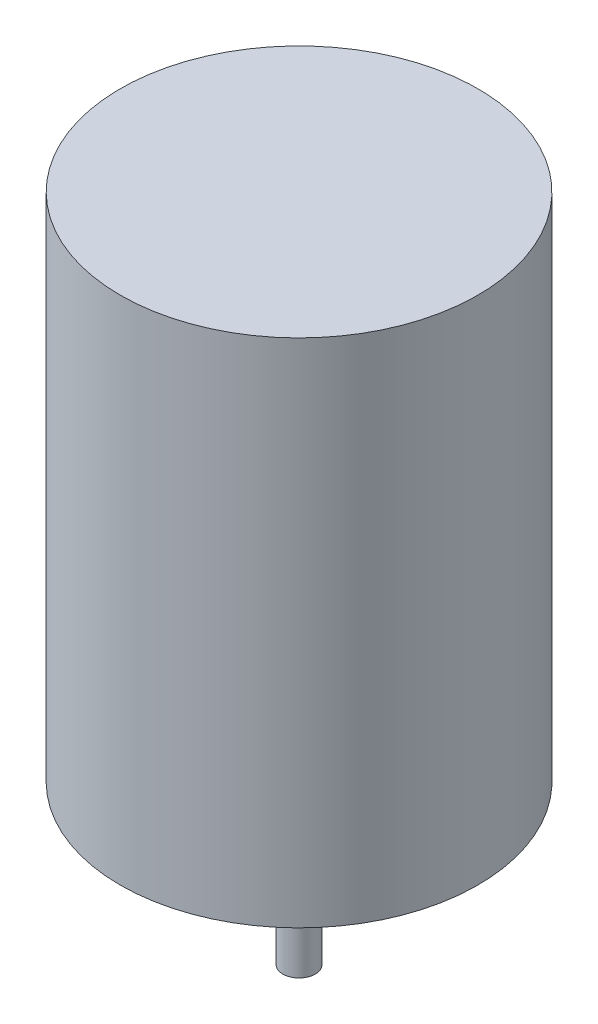
ISO-10303-21;
HEADER;
FILE_DESCRIPTION(('STEP AP214'),'2;1');
FILE_NAME('part.step','',(''),(''),'','','');
FILE_SCHEMA(('AUTOMOTIVE_DESIGN { 1 0 10303 214 1 1 1 1 }'));
ENDSEC;
DATA;
#1=APPLICATION_CONTEXT('core data for automotive mechanical design processes');
#2=APPLICATION_PROTOCOL_DEFINITION('international standard','automotive_design',2000,#1);
#3=PRODUCT_CONTEXT('',#1,'mechanical');
#4=PRODUCT('Part','Part','',(#3));
#5=PRODUCT_RELATED_PRODUCT_CATEGORY('part','',(#4));
#6=PRODUCT_DEFINITION_FORMATION('','',#4);
#7=PRODUCT_DEFINITION_CONTEXT('part definition',#1,'design');
#8=PRODUCT_DEFINITION('design','',#6,#7);
#9=PRODUCT_DEFINITION_SHAPE('','',#8);
#10=(LENGTH_UNIT() NAMED_UNIT(*) SI_UNIT(.MILLI.,.METRE.));
#11=(NAMED_UNIT(*) PLANE_ANGLE_UNIT() SI_UNIT($,.RADIAN.));
#12=(NAMED_UNIT(*) SI_UNIT($,.STERADIAN.) SOLID_ANGLE_UNIT());
#13=UNCERTAINTY_MEASURE_WITH_UNIT(LENGTH_MEASURE(1.E-05),#10,'distance_accuracy_value','');
#14=(GEOMETRIC_REPRESENTATION_CONTEXT(3) GLOBAL_UNCERTAINTY_ASSIGNED_CONTEXT((#13)) GLOBAL_UNIT_ASSIGNED_CONTEXT((#10,
#11,#12)) REPRESENTATION_CONTEXT('',''));
#15=CARTESIAN_POINT('',(0.,0.,0.));
#16=DIRECTION('',(0.,0.,1.));
#17=DIRECTION('',(1.,0.,0.));
#18=AXIS2_PLACEMENT_3D('',#15,#16,#17);
#19=CARTESIAN_POINT('',(0.,50.,0.));
#20=DIRECTION('',(0.,-1.,0.));
#21=DIRECTION('',(0.,0.,-1.));
#22=AXIS2_PLACEMENT_3D('',#19,#20,#21);
#23=CYLINDRICAL_SURFACE('',#22,17.5);
#24=CARTESIAN_POINT('',(0.,50.,0.));
#25=DIRECTION('',(0.,1.,0.));
#26=DIRECTION('',(0.,0.,1.));
#27=AXIS2_PLACEMENT_3D('',#24,#25,#26);
#28=CIRCLE('',#27,17.5);
#29=CARTESIAN_POINT('',(0.,50.,17.5));
#30=VERTEX_POINT('',#29);
#31=EDGE_CURVE('E10',#30,#30,#28,.T.);
#32=ORIENTED_EDGE('',*,*,#31,.F.);
#33=EDGE_LOOP('',(#32));
#34=FACE_BOUND('',#33,.T.);
#35=CARTESIAN_POINT('',(0.,0.,0.));
#36=DIRECTION('',(0.,1.,0.));
#37=DIRECTION('',(0.,0.,1.));
#38=AXIS2_PLACEMENT_3D('',#35,#36,#37);
#39=CIRCLE('',#38,17.5);
#40=CARTESIAN_POINT('',(0.,0.,17.5));
#41=VERTEX_POINT('',#40);
#42=EDGE_CURVE('E33',#41,#41,#39,.T.);
#43=ORIENTED_EDGE('',*,*,#42,.T.);
#44=EDGE_LOOP('',(#43));
#45=FACE_BOUND('',#44,.T.);
#46=ADVANCED_FACE('F30',(#34,#45),#23,.T.);
#47=CARTESIAN_POINT('',(0.,50.,0.));
#48=DIRECTION('',(0.,1.,0.));
#49=DIRECTION('',(0.,0.,1.));
#50=AXIS2_PLACEMENT_3D('',#47,#48,#49);
#51=PLANE('',#50);
#52=ORIENTED_EDGE('',*,*,#31,.T.);
#53=EDGE_LOOP('',(#52));
#54=FACE_BOUND('',#53,.T.);
#55=ADVANCED_FACE('F85',(#54),#51,.T.);
#56=CARTESIAN_POINT('',(0.,0.,0.));
#57=DIRECTION('',(0.,1.,0.));
#58=DIRECTION('',(0.,0.,1.));
#59=AXIS2_PLACEMENT_3D('',#56,#57,#58);
#60=PLANE('',#59);
#61=CARTESIAN_POINT('',(0.,0.,-12.5));
#62=DIRECTION('',(0.,1.,0.));
#63=DIRECTION('',(0.,0.,1.));
#64=AXIS2_PLACEMENT_3D('',#61,#62,#63);
#65=CIRCLE('',#64,1.5);
#66=CARTESIAN_POINT('',(0.,0.,-11.));
#67=VERTEX_POINT('',#66);
#68=EDGE_CURVE('E57',#67,#67,#65,.T.);
#69=ORIENTED_EDGE('',*,*,#68,.T.);
#70=EDGE_LOOP('',(#69));
#71=FACE_BOUND('',#70,.T.);
#72=CARTESIAN_POINT('',(0.,0.,12.5));
#73=DIRECTION('',(0.,1.,0.));
#74=DIRECTION('',(0.,0.,1.));
#75=AXIS2_PLACEMENT_3D('',#72,#73,#74);
#76=CIRCLE('',#75,1.5);
#77=CARTESIAN_POINT('',(0.,0.,14.));
#78=VERTEX_POINT('',#77);
#79=EDGE_CURVE('E54',#78,#78,#76,.T.);
#80=ORIENTED_EDGE('',*,*,#79,.T.);
#81=EDGE_LOOP('',(#80));
#82=FACE_BOUND('',#81,.T.);
#83=CARTESIAN_POINT('',(0.,0.,0.));
#84=DIRECTION('',(0.,1.,0.));
#85=DIRECTION('',(0.,0.,1.));
#86=AXIS2_PLACEMENT_3D('',#83,#84,#85);
#87=CIRCLE('',#86,5.);
#88=CARTESIAN_POINT('',(0.,0.,5.));
#89=VERTEX_POINT('',#88);
#90=EDGE_CURVE('E42',#89,#89,#87,.T.);
#91=ORIENTED_EDGE('',*,*,#90,.T.);
#92=EDGE_LOOP('',(#91));
#93=FACE_BOUND('',#92,.T.);
#94=ORIENTED_EDGE('',*,*,#42,.F.);
#95=EDGE_LOOP('',(#94));
#96=FACE_BOUND('',#95,.T.);
#97=ADVANCED_FACE('F66',(#71,#82,#93,#96),#60,.F.);
#98=CARTESIAN_POINT('',(0.,-2.,0.));
#99=DIRECTION('',(0.,1.,0.));
#100=DIRECTION('',(0.,0.,1.));
#101=AXIS2_PLACEMENT_3D('',#98,#99,#100);
#102=CYLINDRICAL_SURFACE('',#101,5.);
#103=CARTESIAN_POINT('',(0.,-2.,0.));
#104=DIRECTION('',(0.,1.,0.));
#105=DIRECTION('',(0.,0.,1.));
#106=AXIS2_PLACEMENT_3D('',#103,#104,#105);
#107=CIRCLE('',#106,5.);
#108=CARTESIAN_POINT('',(0.,-2.,5.));
#109=VERTEX_POINT('',#108);
#110=EDGE_CURVE('E40',#109,#109,#107,.T.);
#111=ORIENTED_EDGE('',*,*,#110,.T.);
#112=EDGE_LOOP('',(#111));
#113=FACE_BOUND('',#112,.T.);
#114=ORIENTED_EDGE('',*,*,#90,.F.);
#115=EDGE_LOOP('',(#114));
#116=FACE_BOUND('',#115,.T.);
#117=ADVANCED_FACE('F95',(#113,#116),#102,.T.);
#118=CARTESIAN_POINT('',(0.,-2.,0.));
#119=DIRECTION('',(0.,1.,0.));
#120=DIRECTION('',(0.,0.,1.));
#121=AXIS2_PLACEMENT_3D('',#118,#119,#120);
#122=PLANE('',#121);
#123=CARTESIAN_POINT('',(0.,-2.,0.));
#124=DIRECTION('',(0.,1.,0.));
#125=DIRECTION('',(0.,0.,1.));
#126=AXIS2_PLACEMENT_3D('',#123,#124,#125);
#127=CIRCLE('',#126,1.5875);
#128=CARTESIAN_POINT('',(0.,-2.,1.5875));
#129=VERTEX_POINT('',#128);
#130=EDGE_CURVE('E48',#129,#129,#127,.T.);
#131=ORIENTED_EDGE('',*,*,#130,.T.);
#132=EDGE_LOOP('',(#131));
#133=FACE_BOUND('',#132,.T.);
#134=ORIENTED_EDGE('',*,*,#110,.F.);
#135=EDGE_LOOP('',(#134));
#136=FACE_BOUND('',#135,.T.);
#137=ADVANCED_FACE('F99',(#133,#136),#122,.F.);
#138=CARTESIAN_POINT('',(0.,-15.5,0.));
#139=DIRECTION('',(0.,1.,0.));
#140=DIRECTION('',(0.,0.,1.));
#141=AXIS2_PLACEMENT_3D('',#138,#139,#140);
#142=CYLINDRICAL_SURFACE('',#141,1.5875);
#143=CARTESIAN_POINT('',(0.,-15.5,0.));
#144=DIRECTION('',(0.,1.,0.));
#145=DIRECTION('',(0.,0.,1.));
#146=AXIS2_PLACEMENT_3D('',#143,#144,#145);
#147=CIRCLE('',#146,1.5875);
#148=CARTESIAN_POINT('',(0.,-15.5,1.5875));
#149=VERTEX_POINT('',#148);
#150=EDGE_CURVE('E45',#149,#149,#147,.T.);
#151=ORIENTED_EDGE('',*,*,#150,.T.);
#152=EDGE_LOOP('',(#151));
#153=FACE_BOUND('',#152,.T.);
#154=ORIENTED_EDGE('',*,*,#130,.F.);
#155=EDGE_LOOP('',(#154));
#156=FACE_BOUND('',#155,.T.);
#157=ADVANCED_FACE('F105',(#153,#156),#142,.T.);
#158=CARTESIAN_POINT('',(0.,-15.5,0.));
#159=DIRECTION('',(0.,1.,0.));
#160=DIRECTION('',(0.,0.,1.));
#161=AXIS2_PLACEMENT_3D('',#158,#159,#160);
#162=PLANE('',#161);
#163=ORIENTED_EDGE('',*,*,#150,.F.);
#164=EDGE_LOOP('',(#163));
#165=FACE_BOUND('',#164,.T.);
#166=ADVANCED_FACE('F109',(#165),#162,.F.);
#167=CARTESIAN_POINT('',(0.,13.5,12.5));
#168=DIRECTION('',(0.,-1.,0.));
#169=DIRECTION('',(0.,0.,-1.));
#170=AXIS2_PLACEMENT_3D('',#167,#168,#169);
#171=CYLINDRICAL_SURFACE('',#170,1.5);
#172=CARTESIAN_POINT('',(0.,13.5,12.5));
#173=DIRECTION('',(0.,1.,0.));
#174=DIRECTION('',(0.,0.,1.));
#175=AXIS2_PLACEMENT_3D('',#172,#173,#174);
#176=CIRCLE('',#175,1.5);
#177=CARTESIAN_POINT('',(0.,13.5,14.));
#178=VERTEX_POINT('',#177);
#179=EDGE_CURVE('E51',#178,#178,#176,.T.);
#180=ORIENTED_EDGE('',*,*,#179,.T.);
#181=EDGE_LOOP('',(#180));
#182=FACE_BOUND('',#181,.T.);
#183=ORIENTED_EDGE('',*,*,#79,.F.);
#184=EDGE_LOOP('',(#183));
#185=FACE_BOUND('',#184,.T.);
#186=ADVANCED_FACE('F81',(#182,#185),#171,.F.);
#187=CARTESIAN_POINT('',(0.,13.5,12.5));
#188=DIRECTION('',(0.,1.,0.));
#189=DIRECTION('',(0.,0.,1.));
#190=AXIS2_PLACEMENT_3D('',#187,#188,#189);
#191=PLANE('',#190);
#192=ORIENTED_EDGE('',*,*,#179,.F.);
#193=EDGE_LOOP('',(#192));
#194=FACE_BOUND('',#193,.T.);
#195=ADVANCED_FACE('F72',(#194),#191,.F.);
#196=CARTESIAN_POINT('',(0.,13.5,-12.5));
#197=DIRECTION('',(0.,-1.,0.));
#198=DIRECTION('',(0.,0.,-1.));
#199=AXIS2_PLACEMENT_3D('',#196,#197,#198);
#200=CYLINDRICAL_SURFACE('',#199,1.5);
#201=CARTESIAN_POINT('',(0.,13.5,-12.5));
#202=DIRECTION('',(0.,1.,0.));
#203=DIRECTION('',(0.,0.,1.));
#204=AXIS2_PLACEMENT_3D('',#201,#202,#203);
#205=CIRCLE('',#204,1.5);
#206=CARTESIAN_POINT('',(0.,13.5,-11.));
#207=VERTEX_POINT('',#206);
#208=EDGE_CURVE('E60',#207,#207,#205,.T.);
#209=ORIENTED_EDGE('',*,*,#208,.T.);
#210=EDGE_LOOP('',(#209));
#211=FACE_BOUND('',#210,.T.);
#212=ORIENTED_EDGE('',*,*,#68,.F.);
#213=EDGE_LOOP('',(#212));
#214=FACE_BOUND('',#213,.T.);
#215=ADVANCED_FACE('F69',(#211,#214),#200,.F.);
#216=CARTESIAN_POINT('',(0.,13.5,-12.5));
#217=DIRECTION('',(0.,1.,0.));
#218=DIRECTION('',(0.,0.,1.));
#219=AXIS2_PLACEMENT_3D('',#216,#217,#218);
#220=PLANE('',#219);
#221=ORIENTED_EDGE('',*,*,#208,.F.);
#222=EDGE_LOOP('',(#221));
#223=FACE_BOUND('',#222,.T.);
#224=ADVANCED_FACE('F71',(#223),#220,.F.);
#225=CLOSED_SHELL('',(#46,#55,#97,#117,#137,#157,#166,#186,#195,#215,#224));
#226=MANIFOLD_SOLID_BREP('B2',#225);
#227=ADVANCED_BREP_SHAPE_REPRESENTATION('',(#18,#226),#14);
#228=SHAPE_DEFINITION_REPRESENTATION(#9,#227);
ENDSEC;
END-ISO-10303-21;
